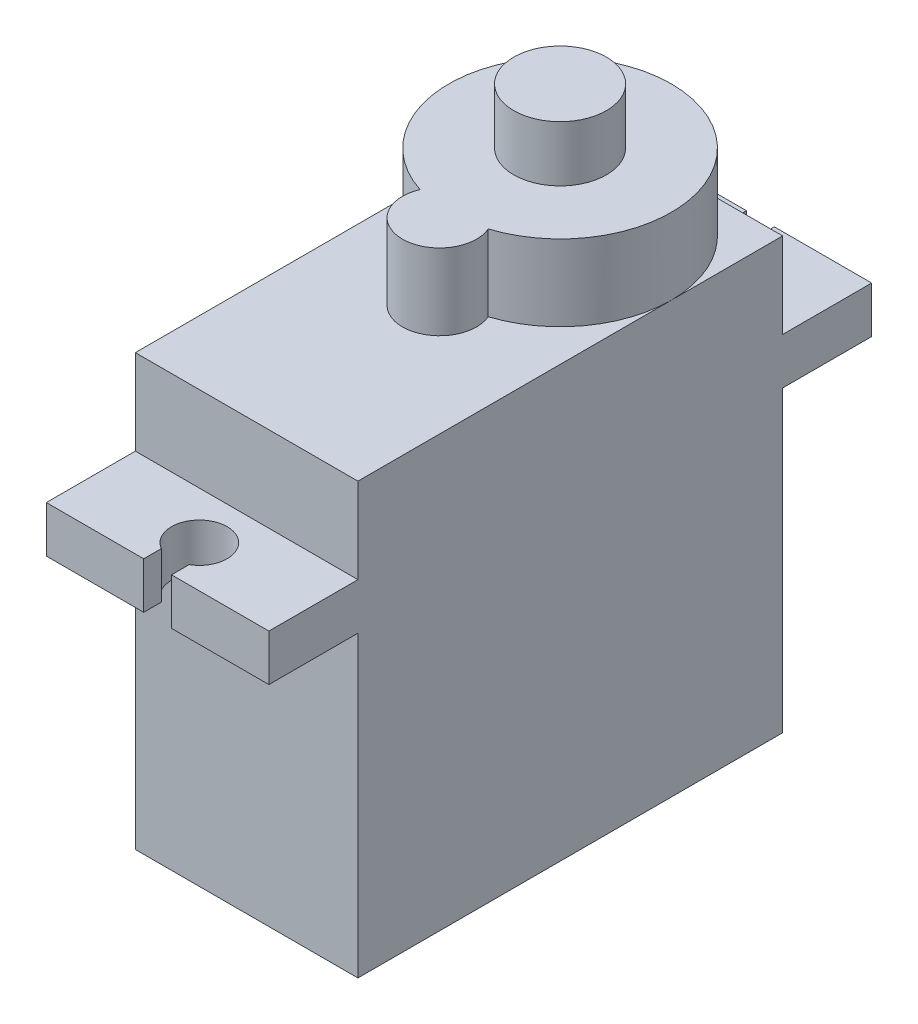
ISO-10303-21;
HEADER;
FILE_DESCRIPTION(('STEP AP214'),'2;1');
FILE_NAME('part.step','',(''),(''),'','','');
FILE_SCHEMA(('AUTOMOTIVE_DESIGN { 1 0 10303 214 1 1 1 1 }'));
ENDSEC;
DATA;
#1=APPLICATION_CONTEXT('core data for automotive mechanical design processes');
#2=APPLICATION_PROTOCOL_DEFINITION('international standard','automotive_design',2000,#1);
#3=PRODUCT_CONTEXT('',#1,'mechanical');
#4=PRODUCT('Part','Part','',(#3));
#5=PRODUCT_RELATED_PRODUCT_CATEGORY('part','',(#4));
#6=PRODUCT_DEFINITION_FORMATION('','',#4);
#7=PRODUCT_DEFINITION_CONTEXT('part definition',#1,'design');
#8=PRODUCT_DEFINITION('design','',#6,#7);
#9=PRODUCT_DEFINITION_SHAPE('','',#8);
#10=(LENGTH_UNIT() NAMED_UNIT(*) SI_UNIT(.MILLI.,.METRE.));
#11=(NAMED_UNIT(*) PLANE_ANGLE_UNIT() SI_UNIT($,.RADIAN.));
#12=(NAMED_UNIT(*) SI_UNIT($,.STERADIAN.) SOLID_ANGLE_UNIT());
#13=UNCERTAINTY_MEASURE_WITH_UNIT(LENGTH_MEASURE(1.E-05),#10,'distance_accuracy_value','');
#14=(GEOMETRIC_REPRESENTATION_CONTEXT(3) GLOBAL_UNCERTAINTY_ASSIGNED_CONTEXT((#13)) GLOBAL_UNIT_ASSIGNED_CONTEXT((#10,
#11,#12)) REPRESENTATION_CONTEXT('',''));
#15=CARTESIAN_POINT('',(0.,0.,0.));
#16=DIRECTION('',(0.,0.,1.));
#17=DIRECTION('',(1.,0.,0.));
#18=AXIS2_PLACEMENT_3D('',#15,#16,#17);
#19=CARTESIAN_POINT('',(0.,23.2,-22.9));
#20=DIRECTION('',(0.,0.,1.));
#21=DIRECTION('',(1.,0.,0.));
#22=AXIS2_PLACEMENT_3D('',#19,#20,#21);
#23=PLANE('',#22);
#24=DIRECTION('',(0.,-1.,0.));
#25=VECTOR('',#24,1.);
#26=CARTESIAN_POINT('',(8.,0.,-22.9));
#27=LINE('',#26,#25);
#28=CARTESIAN_POINT('',(8.,3.,-22.9));
#29=VERTEX_POINT('',#28);
#30=CARTESIAN_POINT('',(8.,0.,-22.9));
#31=VERTEX_POINT('',#30);
#32=EDGE_CURVE('E59',#29,#31,#27,.T.);
#33=ORIENTED_EDGE('',*,*,#32,.F.);
#34=DIRECTION('',(1.,0.,0.));
#35=VECTOR('',#34,1.);
#36=CARTESIAN_POINT('',(0.,3.,-22.9));
#37=LINE('',#36,#35);
#38=CARTESIAN_POINT('',(4.,3.,-22.9));
#39=VERTEX_POINT('',#38);
#40=EDGE_CURVE('E64',#39,#29,#37,.T.);
#41=ORIENTED_EDGE('',*,*,#40,.F.);
#42=DIRECTION('',(0.,-1.,0.));
#43=VECTOR('',#42,1.);
#44=CARTESIAN_POINT('',(4.,0.,-22.9));
#45=LINE('',#44,#43);
#46=CARTESIAN_POINT('',(4.,0.,-22.9));
#47=VERTEX_POINT('',#46);
#48=EDGE_CURVE('E245',#39,#47,#45,.T.);
#49=ORIENTED_EDGE('',*,*,#48,.T.);
#50=DIRECTION('',(-1.,0.,0.));
#51=VECTOR('',#50,1.);
#52=CARTESIAN_POINT('',(0.,0.,-22.9));
#53=LINE('',#52,#51);
#54=CARTESIAN_POINT('',(0.,0.,-22.9));
#55=VERTEX_POINT('',#54);
#56=EDGE_CURVE('E465',#47,#55,#53,.T.);
#57=ORIENTED_EDGE('',*,*,#56,.T.);
#58=DIRECTION('',(0.,-1.,0.));
#59=VECTOR('',#58,1.);
#60=CARTESIAN_POINT('',(0.,23.2,-22.9));
#61=LINE('',#60,#59);
#62=CARTESIAN_POINT('',(0.,16.1,-22.9));
#63=VERTEX_POINT('',#62);
#64=EDGE_CURVE('E453',#63,#55,#61,.T.);
#65=ORIENTED_EDGE('',*,*,#64,.F.);
#66=DIRECTION('',(1.,0.,0.));
#67=VECTOR('',#66,1.);
#68=CARTESIAN_POINT('',(0.,16.1,-22.9));
#69=LINE('',#68,#67);
#70=CARTESIAN_POINT('',(12.,16.1,-22.9));
#71=VERTEX_POINT('',#70);
#72=EDGE_CURVE('E312',#63,#71,#69,.T.);
#73=ORIENTED_EDGE('',*,*,#72,.T.);
#74=DIRECTION('',(0.,-1.,0.));
#75=VECTOR('',#74,1.);
#76=CARTESIAN_POINT('',(12.,23.2,-22.9));
#77=LINE('',#76,#75);
#78=CARTESIAN_POINT('',(12.,0.,-22.9));
#79=VERTEX_POINT('',#78);
#80=EDGE_CURVE('E473',#71,#79,#77,.T.);
#81=ORIENTED_EDGE('',*,*,#80,.T.);
#82=EDGE_CURVE('E466',#79,#31,#53,.T.);
#83=ORIENTED_EDGE('',*,*,#82,.T.);
#84=EDGE_LOOP('',(#33,#41,#49,#57,#65,#73,#81,#83));
#85=FACE_BOUND('',#84,.T.);
#86=ADVANCED_FACE('F40',(#85),#23,.F.);
#87=CARTESIAN_POINT('',(12.,18.6,-27.7));
#88=DIRECTION('',(0.,1.,0.));
#89=DIRECTION('',(0.,0.,1.));
#90=AXIS2_PLACEMENT_3D('',#87,#88,#89);
#91=PLANE('',#90);
#92=CARTESIAN_POINT('',(6.,18.6,-25.45));
#93=DIRECTION('',(0.,-1.,0.));
#94=DIRECTION('',(0.,0.,-1.));
#95=AXIS2_PLACEMENT_3D('',#92,#93,#94);
#96=CIRCLE('',#95,1.5);
#97=CARTESIAN_POINT('',(6.75,18.6,-26.7490381056767));
#98=VERTEX_POINT('',#97);
#99=CARTESIAN_POINT('',(5.25,18.6,-26.7490381056767));
#100=VERTEX_POINT('',#99);
#101=EDGE_CURVE('E261',#98,#100,#96,.T.);
#102=ORIENTED_EDGE('',*,*,#101,.T.);
#103=DIRECTION('',(0.,0.,-1.));
#104=VECTOR('',#103,1.);
#105=CARTESIAN_POINT('',(5.25,18.6,-22.9));
#106=LINE('',#105,#104);
#107=CARTESIAN_POINT('',(5.25,18.6,-27.7));
#108=VERTEX_POINT('',#107);
#109=EDGE_CURVE('E268',#100,#108,#106,.T.);
#110=ORIENTED_EDGE('',*,*,#109,.T.);
#111=DIRECTION('',(-1.,0.,0.));
#112=VECTOR('',#111,1.);
#113=CARTESIAN_POINT('',(12.,18.6,-27.7));
#114=LINE('',#113,#112);
#115=CARTESIAN_POINT('',(0.,18.6,-27.7));
#116=VERTEX_POINT('',#115);
#117=EDGE_CURVE('E295',#108,#116,#114,.T.);
#118=ORIENTED_EDGE('',*,*,#117,.T.);
#119=DIRECTION('',(0.,0.,1.));
#120=VECTOR('',#119,1.);
#121=CARTESIAN_POINT('',(0.,18.6,-27.7));
#122=LINE('',#121,#120);
#123=CARTESIAN_POINT('',(0.,18.6,-22.9));
#124=VERTEX_POINT('',#123);
#125=EDGE_CURVE('E308',#116,#124,#122,.T.);
#126=ORIENTED_EDGE('',*,*,#125,.T.);
#127=DIRECTION('',(-1.,0.,0.));
#128=VECTOR('',#127,1.);
#129=CARTESIAN_POINT('',(12.,18.6,-22.9));
#130=LINE('',#129,#128);
#131=CARTESIAN_POINT('',(12.,18.6,-22.9));
#132=VERTEX_POINT('',#131);
#133=EDGE_CURVE('E289',#132,#124,#130,.T.);
#134=ORIENTED_EDGE('',*,*,#133,.F.);
#135=DIRECTION('',(0.,0.,1.));
#136=VECTOR('',#135,1.);
#137=CARTESIAN_POINT('',(12.,18.6,-27.7));
#138=LINE('',#137,#136);
#139=CARTESIAN_POINT('',(12.,18.6,-27.7));
#140=VERTEX_POINT('',#139);
#141=EDGE_CURVE('E325',#140,#132,#138,.T.);
#142=ORIENTED_EDGE('',*,*,#141,.F.);
#143=CARTESIAN_POINT('',(6.75,18.6,-27.7));
#144=VERTEX_POINT('',#143);
#145=EDGE_CURVE('E290',#140,#144,#114,.T.);
#146=ORIENTED_EDGE('',*,*,#145,.T.);
#147=DIRECTION('',(0.,0.,-1.));
#148=VECTOR('',#147,1.);
#149=CARTESIAN_POINT('',(6.75,18.6,-22.9));
#150=LINE('',#149,#148);
#151=EDGE_CURVE('E265',#98,#144,#150,.T.);
#152=ORIENTED_EDGE('',*,*,#151,.F.);
#153=EDGE_LOOP('',(#102,#110,#118,#126,#134,#142,#146,#152));
#154=FACE_BOUND('',#153,.T.);
#155=ADVANCED_FACE('F528',(#154),#91,.T.);
#156=CARTESIAN_POINT('',(0.,16.1,-27.7));
#157=DIRECTION('',(0.,-1.,0.));
#158=DIRECTION('',(0.,0.,-1.));
#159=AXIS2_PLACEMENT_3D('',#156,#157,#158);
#160=PLANE('',#159);
#161=DIRECTION('',(1.,0.,0.));
#162=VECTOR('',#161,1.);
#163=CARTESIAN_POINT('',(0.,16.1,-27.7));
#164=LINE('',#163,#162);
#165=CARTESIAN_POINT('',(0.,16.1,-27.7));
#166=VERTEX_POINT('',#165);
#167=CARTESIAN_POINT('',(5.25,16.1,-27.7));
#168=VERTEX_POINT('',#167);
#169=EDGE_CURVE('E300',#166,#168,#164,.T.);
#170=ORIENTED_EDGE('',*,*,#169,.T.);
#171=DIRECTION('',(0.,0.,-1.));
#172=VECTOR('',#171,1.);
#173=CARTESIAN_POINT('',(5.25,16.1,-22.9));
#174=LINE('',#173,#172);
#175=CARTESIAN_POINT('',(5.25,16.1,-26.7490381056767));
#176=VERTEX_POINT('',#175);
#177=EDGE_CURVE('E253',#176,#168,#174,.T.);
#178=ORIENTED_EDGE('',*,*,#177,.F.);
#179=CARTESIAN_POINT('',(6.,16.1,-25.45));
#180=DIRECTION('',(0.,-1.,0.));
#181=DIRECTION('',(0.,0.,-1.));
#182=AXIS2_PLACEMENT_3D('',#179,#180,#181);
#183=CIRCLE('',#182,1.5);
#184=CARTESIAN_POINT('',(6.75,16.1,-26.7490381056767));
#185=VERTEX_POINT('',#184);
#186=EDGE_CURVE('E249',#185,#176,#183,.T.);
#187=ORIENTED_EDGE('',*,*,#186,.F.);
#188=DIRECTION('',(0.,0.,-1.));
#189=VECTOR('',#188,1.);
#190=CARTESIAN_POINT('',(6.75,16.1,-22.9));
#191=LINE('',#190,#189);
#192=CARTESIAN_POINT('',(6.75,16.1,-27.7));
#193=VERTEX_POINT('',#192);
#194=EDGE_CURVE('E276',#185,#193,#191,.T.);
#195=ORIENTED_EDGE('',*,*,#194,.T.);
#196=CARTESIAN_POINT('',(12.,16.1,-27.7));
#197=VERTEX_POINT('',#196);
#198=EDGE_CURVE('E299',#193,#197,#164,.T.);
#199=ORIENTED_EDGE('',*,*,#198,.T.);
#200=DIRECTION('',(0.,0.,1.));
#201=VECTOR('',#200,1.);
#202=CARTESIAN_POINT('',(12.,16.1,-27.7));
#203=LINE('',#202,#201);
#204=EDGE_CURVE('E322',#197,#71,#203,.T.);
#205=ORIENTED_EDGE('',*,*,#204,.T.);
#206=ORIENTED_EDGE('',*,*,#72,.F.);
#207=DIRECTION('',(0.,0.,1.));
#208=VECTOR('',#207,1.);
#209=CARTESIAN_POINT('',(0.,16.1,-27.7));
#210=LINE('',#209,#208);
#211=EDGE_CURVE('E318',#166,#63,#210,.T.);
#212=ORIENTED_EDGE('',*,*,#211,.F.);
#213=EDGE_LOOP('',(#170,#178,#187,#195,#199,#205,#206,#212));
#214=FACE_BOUND('',#213,.T.);
#215=ADVANCED_FACE('F541',(#214),#160,.T.);
#216=CARTESIAN_POINT('',(0.,0.,-27.7));
#217=DIRECTION('',(0.,0.,-1.));
#218=DIRECTION('',(1.,0.,0.));
#219=AXIS2_PLACEMENT_3D('',#216,#217,#218);
#220=PLANE('',#219);
#221=ORIENTED_EDGE('',*,*,#117,.F.);
#222=DIRECTION('',(0.,1.,0.));
#223=VECTOR('',#222,1.);
#224=CARTESIAN_POINT('',(5.25,-0.001000000000001,-27.7));
#225=LINE('',#224,#223);
#226=EDGE_CURVE('E277',#168,#108,#225,.T.);
#227=ORIENTED_EDGE('',*,*,#226,.F.);
#228=ORIENTED_EDGE('',*,*,#169,.F.);
#229=DIRECTION('',(0.,-1.,0.));
#230=VECTOR('',#229,1.);
#231=CARTESIAN_POINT('',(0.,18.6,-27.7));
#232=LINE('',#231,#230);
#233=EDGE_CURVE('E304',#116,#166,#232,.T.);
#234=ORIENTED_EDGE('',*,*,#233,.F.);
#235=EDGE_LOOP('',(#221,#227,#228,#234));
#236=FACE_BOUND('',#235,.T.);
#237=ADVANCED_FACE('F538',(#236),#220,.T.);
#238=CARTESIAN_POINT('',(12.,23.2,-22.9));
#239=VERTEX_POINT('',#238);
#240=EDGE_CURVE('E474',#239,#132,#77,.T.);
#241=ORIENTED_EDGE('',*,*,#240,.T.);
#242=ORIENTED_EDGE('',*,*,#133,.T.);
#243=CARTESIAN_POINT('',(0.,23.2,-22.9));
#244=VERTEX_POINT('',#243);
#245=EDGE_CURVE('E469',#244,#124,#61,.T.);
#246=ORIENTED_EDGE('',*,*,#245,.F.);
#247=DIRECTION('',(-1.,0.,0.));
#248=VECTOR('',#247,1.);
#249=CARTESIAN_POINT('',(0.,23.2,-22.9));
#250=LINE('',#249,#248);
#251=CARTESIAN_POINT('',(6.,23.2,-22.9));
#252=VERTEX_POINT('',#251);
#253=EDGE_CURVE('E448',#252,#244,#250,.T.);
#254=ORIENTED_EDGE('',*,*,#253,.F.);
#255=EDGE_CURVE('E449',#239,#252,#250,.T.);
#256=ORIENTED_EDGE('',*,*,#255,.F.);
#257=EDGE_LOOP('',(#241,#242,#246,#254,#256));
#258=FACE_BOUND('',#257,.T.);
#259=ADVANCED_FACE('F569',(#258),#23,.F.);
#260=CARTESIAN_POINT('',(12.,18.6,4.8));
#261=DIRECTION('',(0.,-1.,0.));
#262=DIRECTION('',(0.,0.,-1.));
#263=AXIS2_PLACEMENT_3D('',#260,#261,#262);
#264=PLANE('',#263);
#265=DIRECTION('',(0.,0.,1.));
#266=VECTOR('',#265,1.);
#267=CARTESIAN_POINT('',(6.75,18.6,0.));
#268=LINE('',#267,#266);
#269=CARTESIAN_POINT('',(6.75,18.6,3.84903810567666));
#270=VERTEX_POINT('',#269);
#271=CARTESIAN_POINT('',(6.75,18.6,4.8));
#272=VERTEX_POINT('',#271);
#273=EDGE_CURVE('E343',#270,#272,#268,.T.);
#274=ORIENTED_EDGE('',*,*,#273,.T.);
#275=DIRECTION('',(-1.,0.,0.));
#276=VECTOR('',#275,1.);
#277=CARTESIAN_POINT('',(12.,18.6,4.8));
#278=LINE('',#277,#276);
#279=CARTESIAN_POINT('',(12.,18.6,4.8));
#280=VERTEX_POINT('',#279);
#281=EDGE_CURVE('E365',#280,#272,#278,.T.);
#282=ORIENTED_EDGE('',*,*,#281,.F.);
#283=DIRECTION('',(0.,0.,-1.));
#284=VECTOR('',#283,1.);
#285=CARTESIAN_POINT('',(12.,18.6,4.8));
#286=LINE('',#285,#284);
#287=CARTESIAN_POINT('',(12.,18.6,0.));
#288=VERTEX_POINT('',#287);
#289=EDGE_CURVE('E381',#280,#288,#286,.T.);
#290=ORIENTED_EDGE('',*,*,#289,.T.);
#291=DIRECTION('',(-1.,0.,0.));
#292=VECTOR('',#291,1.);
#293=CARTESIAN_POINT('',(12.,18.6,0.));
#294=LINE('',#293,#292);
#295=CARTESIAN_POINT('',(0.,18.6,0.));
#296=VERTEX_POINT('',#295);
#297=EDGE_CURVE('E364',#288,#296,#294,.T.);
#298=ORIENTED_EDGE('',*,*,#297,.T.);
#299=DIRECTION('',(0.,0.,-1.));
#300=VECTOR('',#299,1.);
#301=CARTESIAN_POINT('',(0.,18.6,4.8));
#302=LINE('',#301,#300);
#303=CARTESIAN_POINT('',(0.,18.6,4.8));
#304=VERTEX_POINT('',#303);
#305=EDGE_CURVE('E400',#304,#296,#302,.T.);
#306=ORIENTED_EDGE('',*,*,#305,.F.);
#307=CARTESIAN_POINT('',(5.25,18.6,4.8));
#308=VERTEX_POINT('',#307);
#309=EDGE_CURVE('E370',#308,#304,#278,.T.);
#310=ORIENTED_EDGE('',*,*,#309,.F.);
#311=DIRECTION('',(0.,0.,1.));
#312=VECTOR('',#311,1.);
#313=CARTESIAN_POINT('',(5.25,18.6,0.));
#314=LINE('',#313,#312);
#315=CARTESIAN_POINT('',(5.25,18.6,3.84903810567666));
#316=VERTEX_POINT('',#315);
#317=EDGE_CURVE('E340',#316,#308,#314,.T.);
#318=ORIENTED_EDGE('',*,*,#317,.F.);
#319=CARTESIAN_POINT('',(6.,18.6,2.55));
#320=DIRECTION('',(0.,1.,0.));
#321=DIRECTION('',(0.,0.,1.));
#322=AXIS2_PLACEMENT_3D('',#319,#320,#321);
#323=CIRCLE('',#322,1.5);
#324=EDGE_CURVE('E336',#270,#316,#323,.T.);
#325=ORIENTED_EDGE('',*,*,#324,.F.);
#326=EDGE_LOOP('',(#274,#282,#290,#298,#306,#310,#318,#325));
#327=FACE_BOUND('',#326,.T.);
#328=ADVANCED_FACE('F608',(#327),#264,.F.);
#329=CARTESIAN_POINT('',(0.,16.1,4.8));
#330=DIRECTION('',(0.,1.,0.));
#331=DIRECTION('',(0.,0.,1.));
#332=AXIS2_PLACEMENT_3D('',#329,#330,#331);
#333=PLANE('',#332);
#334=DIRECTION('',(0.,0.,-1.));
#335=VECTOR('',#334,1.);
#336=CARTESIAN_POINT('',(6.75,16.1,0.));
#337=LINE('',#336,#335);
#338=CARTESIAN_POINT('',(6.75,16.1,4.8));
#339=VERTEX_POINT('',#338);
#340=CARTESIAN_POINT('',(6.75,16.1,3.84903810567666));
#341=VERTEX_POINT('',#340);
#342=EDGE_CURVE('E332',#339,#341,#337,.T.);
#343=ORIENTED_EDGE('',*,*,#342,.T.);
#344=CARTESIAN_POINT('',(6.,16.1,2.55));
#345=DIRECTION('',(0.,1.,0.));
#346=DIRECTION('',(0.,0.,1.));
#347=AXIS2_PLACEMENT_3D('',#344,#345,#346);
#348=CIRCLE('',#347,1.5);
#349=CARTESIAN_POINT('',(5.25,16.1,3.84903810567666));
#350=VERTEX_POINT('',#349);
#351=EDGE_CURVE('E328',#350,#341,#348,.F.);
#352=ORIENTED_EDGE('',*,*,#351,.F.);
#353=DIRECTION('',(0.,0.,-1.));
#354=VECTOR('',#353,1.);
#355=CARTESIAN_POINT('',(5.25,16.1,0.));
#356=LINE('',#355,#354);
#357=CARTESIAN_POINT('',(5.25,16.1,4.8));
#358=VERTEX_POINT('',#357);
#359=EDGE_CURVE('E351',#358,#350,#356,.T.);
#360=ORIENTED_EDGE('',*,*,#359,.F.);
#361=DIRECTION('',(1.,0.,0.));
#362=VECTOR('',#361,1.);
#363=CARTESIAN_POINT('',(0.,16.1,4.8));
#364=LINE('',#363,#362);
#365=CARTESIAN_POINT('',(0.,16.1,4.8));
#366=VERTEX_POINT('',#365);
#367=EDGE_CURVE('E374',#366,#358,#364,.T.);
#368=ORIENTED_EDGE('',*,*,#367,.F.);
#369=DIRECTION('',(0.,0.,-1.));
#370=VECTOR('',#369,1.);
#371=CARTESIAN_POINT('',(0.,16.1,4.8));
#372=LINE('',#371,#370);
#373=CARTESIAN_POINT('',(0.,16.1,0.));
#374=VERTEX_POINT('',#373);
#375=EDGE_CURVE('E396',#366,#374,#372,.T.);
#376=ORIENTED_EDGE('',*,*,#375,.T.);
#377=DIRECTION('',(1.,0.,0.));
#378=VECTOR('',#377,1.);
#379=CARTESIAN_POINT('',(0.,16.1,0.));
#380=LINE('',#379,#378);
#381=CARTESIAN_POINT('',(12.,16.1,0.));
#382=VERTEX_POINT('',#381);
#383=EDGE_CURVE('E385',#374,#382,#380,.T.);
#384=ORIENTED_EDGE('',*,*,#383,.T.);
#385=DIRECTION('',(0.,0.,-1.));
#386=VECTOR('',#385,1.);
#387=CARTESIAN_POINT('',(12.,16.1,4.8));
#388=LINE('',#387,#386);
#389=CARTESIAN_POINT('',(12.,16.1,4.8));
#390=VERTEX_POINT('',#389);
#391=EDGE_CURVE('E392',#390,#382,#388,.T.);
#392=ORIENTED_EDGE('',*,*,#391,.F.);
#393=EDGE_CURVE('E373',#339,#390,#364,.T.);
#394=ORIENTED_EDGE('',*,*,#393,.F.);
#395=EDGE_LOOP('',(#343,#352,#360,#368,#376,#384,#392,#394));
#396=FACE_BOUND('',#395,.T.);
#397=ADVANCED_FACE('F613',(#396),#333,.F.);
#398=CARTESIAN_POINT('',(0.,0.,4.8));
#399=DIRECTION('',(0.,0.,1.));
#400=DIRECTION('',(1.,0.,0.));
#401=AXIS2_PLACEMENT_3D('',#398,#399,#400);
#402=PLANE('',#401);
#403=ORIENTED_EDGE('',*,*,#281,.T.);
#404=DIRECTION('',(0.,1.,0.));
#405=VECTOR('',#404,1.);
#406=CARTESIAN_POINT('',(6.75,-0.001000000000001,4.8));
#407=LINE('',#406,#405);
#408=EDGE_CURVE('E352',#339,#272,#407,.T.);
#409=ORIENTED_EDGE('',*,*,#408,.F.);
#410=ORIENTED_EDGE('',*,*,#393,.T.);
#411=DIRECTION('',(0.,1.,0.));
#412=VECTOR('',#411,1.);
#413=CARTESIAN_POINT('',(12.,16.1,4.8));
#414=LINE('',#413,#412);
#415=EDGE_CURVE('E378',#390,#280,#414,.T.);
#416=ORIENTED_EDGE('',*,*,#415,.T.);
#417=EDGE_LOOP('',(#403,#409,#410,#416));
#418=FACE_BOUND('',#417,.T.);
#419=ADVANCED_FACE('F644',(#418),#402,.T.);
#420=CARTESIAN_POINT('',(0.,23.2,0.));
#421=DIRECTION('',(0.,0.,-1.));
#422=DIRECTION('',(-1.,0.,0.));
#423=AXIS2_PLACEMENT_3D('',#420,#421,#422);
#424=PLANE('',#423);
#425=ORIENTED_EDGE('',*,*,#297,.F.);
#426=DIRECTION('',(0.,-1.,0.));
#427=VECTOR('',#426,1.);
#428=CARTESIAN_POINT('',(12.,23.2,0.));
#429=LINE('',#428,#427);
#430=CARTESIAN_POINT('',(12.,23.2,0.));
#431=VERTEX_POINT('',#430);
#432=EDGE_CURVE('E478',#431,#288,#429,.T.);
#433=ORIENTED_EDGE('',*,*,#432,.F.);
#434=DIRECTION('',(1.,0.,0.));
#435=VECTOR('',#434,1.);
#436=CARTESIAN_POINT('',(0.,23.2,0.));
#437=LINE('',#436,#435);
#438=CARTESIAN_POINT('',(0.,23.2,0.));
#439=VERTEX_POINT('',#438);
#440=EDGE_CURVE('E439',#439,#431,#437,.T.);
#441=ORIENTED_EDGE('',*,*,#440,.F.);
#442=DIRECTION('',(0.,-1.,0.));
#443=VECTOR('',#442,1.);
#444=CARTESIAN_POINT('',(0.,23.2,0.));
#445=LINE('',#444,#443);
#446=EDGE_CURVE('E44',#439,#296,#445,.T.);
#447=ORIENTED_EDGE('',*,*,#446,.T.);
#448=EDGE_LOOP('',(#425,#433,#441,#447));
#449=FACE_BOUND('',#448,.T.);
#450=ADVANCED_FACE('F554',(#449),#424,.F.);
#451=ORIENTED_EDGE('',*,*,#383,.F.);
#452=CARTESIAN_POINT('',(0.,0.,0.));
#453=VERTEX_POINT('',#452);
#454=EDGE_CURVE('E481',#374,#453,#445,.T.);
#455=ORIENTED_EDGE('',*,*,#454,.T.);
#456=DIRECTION('',(1.,0.,0.));
#457=VECTOR('',#456,1.);
#458=CARTESIAN_POINT('',(0.,0.,0.));
#459=LINE('',#458,#457);
#460=CARTESIAN_POINT('',(12.,0.,0.));
#461=VERTEX_POINT('',#460);
#462=EDGE_CURVE('E457',#453,#461,#459,.T.);
#463=ORIENTED_EDGE('',*,*,#462,.T.);
#464=EDGE_CURVE('E477',#382,#461,#429,.T.);
#465=ORIENTED_EDGE('',*,*,#464,.F.);
#466=EDGE_LOOP('',(#451,#455,#463,#465));
#467=FACE_BOUND('',#466,.T.);
#468=ADVANCED_FACE('F496',(#467),#424,.F.);
#469=CARTESIAN_POINT('',(0.,23.2,0.));
#470=DIRECTION('',(0.,-1.,0.));
#471=DIRECTION('',(0.,0.,-1.));
#472=AXIS2_PLACEMENT_3D('',#469,#470,#471);
#473=PLANE('',#472);
#474=CARTESIAN_POINT('',(6.,23.2,-10.4));
#475=DIRECTION('',(0.,1.,0.));
#476=DIRECTION('',(0.,0.,1.));
#477=AXIS2_PLACEMENT_3D('',#474,#475,#476);
#478=CIRCLE('',#477,2.);
#479=CARTESIAN_POINT('',(4.16197703976069,23.2,-11.1884615384615));
#480=VERTEX_POINT('',#479);
#481=CARTESIAN_POINT('',(7.83802296023931,23.2,-11.1884615384615));
#482=VERTEX_POINT('',#481);
#483=EDGE_CURVE('E409',#480,#482,#478,.T.);
#484=ORIENTED_EDGE('',*,*,#483,.F.);
#485=CARTESIAN_POINT('',(6.,23.2,-16.9));
#486=DIRECTION('',(0.,1.,0.));
#487=DIRECTION('',(0.,0.,1.));
#488=AXIS2_PLACEMENT_3D('',#485,#486,#487);
#489=CIRCLE('',#488,6.);
#490=CARTESIAN_POINT('',(0.,23.2,-16.9));
#491=VERTEX_POINT('',#490);
#492=EDGE_CURVE('E426',#491,#480,#489,.T.);
#493=ORIENTED_EDGE('',*,*,#492,.F.);
#494=DIRECTION('',(0.,0.,1.));
#495=VECTOR('',#494,1.);
#496=CARTESIAN_POINT('',(0.,23.2,0.));
#497=LINE('',#496,#495);
#498=EDGE_CURVE('E440',#491,#439,#497,.T.);
#499=ORIENTED_EDGE('',*,*,#498,.T.);
#500=ORIENTED_EDGE('',*,*,#440,.T.);
#501=DIRECTION('',(0.,0.,-1.));
#502=VECTOR('',#501,1.);
#503=CARTESIAN_POINT('',(12.,23.2,0.));
#504=LINE('',#503,#502);
#505=CARTESIAN_POINT('',(12.,23.2,-16.9));
#506=VERTEX_POINT('',#505);
#507=EDGE_CURVE('E444',#431,#506,#504,.T.);
#508=ORIENTED_EDGE('',*,*,#507,.T.);
#509=EDGE_CURVE('E52',#482,#506,#489,.T.);
#510=ORIENTED_EDGE('',*,*,#509,.F.);
#511=EDGE_LOOP('',(#484,#493,#499,#500,#508,#510));
#512=FACE_BOUND('',#511,.T.);
#513=ADVANCED_FACE('F550',(#512),#473,.F.);
#514=EDGE_CURVE('E11',#506,#252,#489,.T.);
#515=ORIENTED_EDGE('',*,*,#514,.F.);
#516=EDGE_CURVE('E443',#506,#239,#504,.T.);
#517=ORIENTED_EDGE('',*,*,#516,.T.);
#518=ORIENTED_EDGE('',*,*,#255,.T.);
#519=EDGE_LOOP('',(#515,#517,#518));
#520=FACE_BOUND('',#519,.T.);
#521=ADVANCED_FACE('F571',(#520),#473,.F.);
#522=CARTESIAN_POINT('',(0.,23.2,0.));
#523=DIRECTION('',(1.,0.,0.));
#524=DIRECTION('',(0.,0.,-1.));
#525=AXIS2_PLACEMENT_3D('',#522,#523,#524);
#526=PLANE('',#525);
#527=DIRECTION('',(0.,0.,1.));
#528=VECTOR('',#527,1.);
#529=CARTESIAN_POINT('',(0.,0.,0.));
#530=LINE('',#529,#528);
#531=EDGE_CURVE('E434',#55,#453,#530,.T.);
#532=ORIENTED_EDGE('',*,*,#531,.T.);
#533=ORIENTED_EDGE('',*,*,#454,.F.);
#534=ORIENTED_EDGE('',*,*,#375,.F.);
#535=DIRECTION('',(0.,-1.,0.));
#536=VECTOR('',#535,1.);
#537=CARTESIAN_POINT('',(0.,18.6,4.8));
#538=LINE('',#537,#536);
#539=EDGE_CURVE('E369',#304,#366,#538,.T.);
#540=ORIENTED_EDGE('',*,*,#539,.F.);
#541=ORIENTED_EDGE('',*,*,#305,.T.);
#542=ORIENTED_EDGE('',*,*,#446,.F.);
#543=ORIENTED_EDGE('',*,*,#498,.F.);
#544=EDGE_CURVE('E435',#244,#491,#497,.T.);
#545=ORIENTED_EDGE('',*,*,#544,.F.);
#546=ORIENTED_EDGE('',*,*,#245,.T.);
#547=ORIENTED_EDGE('',*,*,#125,.F.);
#548=ORIENTED_EDGE('',*,*,#233,.T.);
#549=ORIENTED_EDGE('',*,*,#211,.T.);
#550=ORIENTED_EDGE('',*,*,#64,.T.);
#551=EDGE_LOOP('',(#532,#533,#534,#540,#541,#542,#543,#545,#546,#547,#548,#549,#550));
#552=FACE_BOUND('',#551,.T.);
#553=ADVANCED_FACE('F42',(#552),#526,.F.);
#554=CARTESIAN_POINT('',(12.,23.2,0.));
#555=DIRECTION('',(-1.,0.,0.));
#556=DIRECTION('',(0.,0.,1.));
#557=AXIS2_PLACEMENT_3D('',#554,#555,#556);
#558=PLANE('',#557);
#559=DIRECTION('',(0.,0.,-1.));
#560=VECTOR('',#559,1.);
#561=CARTESIAN_POINT('',(12.,0.,0.));
#562=LINE('',#561,#560);
#563=EDGE_CURVE('E461',#461,#79,#562,.T.);
#564=ORIENTED_EDGE('',*,*,#563,.T.);
#565=ORIENTED_EDGE('',*,*,#80,.F.);
#566=ORIENTED_EDGE('',*,*,#204,.F.);
#567=DIRECTION('',(0.,1.,0.));
#568=VECTOR('',#567,1.);
#569=CARTESIAN_POINT('',(12.,16.1,-27.7));
#570=LINE('',#569,#568);
#571=EDGE_CURVE('E294',#197,#140,#570,.T.);
#572=ORIENTED_EDGE('',*,*,#571,.T.);
#573=ORIENTED_EDGE('',*,*,#141,.T.);
#574=ORIENTED_EDGE('',*,*,#240,.F.);
#575=ORIENTED_EDGE('',*,*,#516,.F.);
#576=ORIENTED_EDGE('',*,*,#507,.F.);
#577=ORIENTED_EDGE('',*,*,#432,.T.);
#578=ORIENTED_EDGE('',*,*,#289,.F.);
#579=ORIENTED_EDGE('',*,*,#415,.F.);
#580=ORIENTED_EDGE('',*,*,#391,.T.);
#581=ORIENTED_EDGE('',*,*,#464,.T.);
#582=EDGE_LOOP('',(#564,#565,#566,#572,#573,#574,#575,#576,#577,#578,#579,#580,#581));
#583=FACE_BOUND('',#582,.T.);
#584=ADVANCED_FACE('F488',(#583),#558,.F.);
#585=EDGE_CURVE('E50',#252,#491,#489,.T.);
#586=ORIENTED_EDGE('',*,*,#585,.F.);
#587=ORIENTED_EDGE('',*,*,#253,.T.);
#588=ORIENTED_EDGE('',*,*,#544,.T.);
#589=EDGE_LOOP('',(#586,#587,#588));
#590=FACE_BOUND('',#589,.T.);
#591=ADVANCED_FACE('F566',(#590),#473,.F.);
#592=CARTESIAN_POINT('',(0.,0.,0.));
#593=DIRECTION('',(0.,-1.,0.));
#594=DIRECTION('',(0.,0.,-1.));
#595=AXIS2_PLACEMENT_3D('',#592,#593,#594);
#596=PLANE('',#595);
#597=ORIENTED_EDGE('',*,*,#531,.F.);
#598=ORIENTED_EDGE('',*,*,#56,.F.);
#599=DIRECTION('',(0.,0.,1.));
#600=VECTOR('',#599,1.);
#601=CARTESIAN_POINT('',(4.,0.,-25.9));
#602=LINE('',#601,#600);
#603=CARTESIAN_POINT('',(4.,0.,-25.9));
#604=VERTEX_POINT('',#603);
#605=EDGE_CURVE('E255',#604,#47,#602,.T.);
#606=ORIENTED_EDGE('',*,*,#605,.F.);
#607=DIRECTION('',(-1.,0.,0.));
#608=VECTOR('',#607,1.);
#609=CARTESIAN_POINT('',(0.,0.,-25.9));
#610=LINE('',#609,#608);
#611=CARTESIAN_POINT('',(8.,0.,-25.9));
#612=VERTEX_POINT('',#611);
#613=EDGE_CURVE('E235',#612,#604,#610,.T.);
#614=ORIENTED_EDGE('',*,*,#613,.F.);
#615=DIRECTION('',(0.,0.,1.));
#616=VECTOR('',#615,1.);
#617=CARTESIAN_POINT('',(8.,0.,-25.9));
#618=LINE('',#617,#616);
#619=EDGE_CURVE('E231',#612,#31,#618,.T.);
#620=ORIENTED_EDGE('',*,*,#619,.T.);
#621=ORIENTED_EDGE('',*,*,#82,.F.);
#622=ORIENTED_EDGE('',*,*,#563,.F.);
#623=ORIENTED_EDGE('',*,*,#462,.F.);
#624=EDGE_LOOP('',(#597,#598,#606,#614,#620,#621,#622,#623));
#625=FACE_BOUND('',#624,.T.);
#626=ADVANCED_FACE('F500',(#625),#596,.T.);
#627=CARTESIAN_POINT('',(6.,27.3,-10.4));
#628=DIRECTION('',(0.,-1.,0.));
#629=DIRECTION('',(0.,0.,-1.));
#630=AXIS2_PLACEMENT_3D('',#627,#628,#629);
#631=CYLINDRICAL_SURFACE('',#630,2.);
#632=ORIENTED_EDGE('',*,*,#483,.T.);
#633=DIRECTION('',(0.,-1.,0.));
#634=VECTOR('',#633,1.);
#635=CARTESIAN_POINT('',(7.83802296023931,27.3,-11.1884615384615));
#636=LINE('',#635,#634);
#637=CARTESIAN_POINT('',(7.83802296023931,27.3,-11.1884615384615));
#638=VERTEX_POINT('',#637);
#639=EDGE_CURVE('E430',#638,#482,#636,.T.);
#640=ORIENTED_EDGE('',*,*,#639,.F.);
#641=CARTESIAN_POINT('',(6.,27.3,-10.4));
#642=DIRECTION('',(0.,1.,0.));
#643=DIRECTION('',(0.,0.,1.));
#644=AXIS2_PLACEMENT_3D('',#641,#642,#643);
#645=CIRCLE('',#644,2.);
#646=CARTESIAN_POINT('',(4.16197703976069,27.3,-11.1884615384615));
#647=VERTEX_POINT('',#646);
#648=EDGE_CURVE('E413',#647,#638,#645,.T.);
#649=ORIENTED_EDGE('',*,*,#648,.F.);
#650=DIRECTION('',(0.,-1.,0.));
#651=VECTOR('',#650,1.);
#652=CARTESIAN_POINT('',(4.16197703976069,27.3,-11.1884615384615));
#653=LINE('',#652,#651);
#654=EDGE_CURVE('E420',#647,#480,#653,.T.);
#655=ORIENTED_EDGE('',*,*,#654,.T.);
#656=EDGE_LOOP('',(#632,#640,#649,#655));
#657=FACE_BOUND('',#656,.T.);
#658=ADVANCED_FACE('F661',(#657),#631,.T.);
#659=CARTESIAN_POINT('',(6.,27.3,-16.9));
#660=DIRECTION('',(0.,-1.,0.));
#661=DIRECTION('',(0.,0.,-1.));
#662=AXIS2_PLACEMENT_3D('',#659,#660,#661);
#663=CYLINDRICAL_SURFACE('',#662,6.);
#664=ORIENTED_EDGE('',*,*,#509,.T.);
#665=ORIENTED_EDGE('',*,*,#514,.T.);
#666=ORIENTED_EDGE('',*,*,#585,.T.);
#667=ORIENTED_EDGE('',*,*,#492,.T.);
#668=ORIENTED_EDGE('',*,*,#654,.F.);
#669=CARTESIAN_POINT('',(6.,27.3,-16.9));
#670=DIRECTION('',(0.,1.,0.));
#671=DIRECTION('',(0.,0.,1.));
#672=AXIS2_PLACEMENT_3D('',#669,#670,#671);
#673=CIRCLE('',#672,6.);
#674=EDGE_CURVE('E417',#638,#647,#673,.T.);
#675=ORIENTED_EDGE('',*,*,#674,.F.);
#676=ORIENTED_EDGE('',*,*,#639,.T.);
#677=EDGE_LOOP('',(#664,#665,#666,#667,#668,#675,#676));
#678=FACE_BOUND('',#677,.T.);
#679=ADVANCED_FACE('F563',(#678),#663,.T.);
#680=CARTESIAN_POINT('',(0.,27.3,0.));
#681=DIRECTION('',(0.,1.,0.));
#682=DIRECTION('',(0.,0.,1.));
#683=AXIS2_PLACEMENT_3D('',#680,#681,#682);
#684=PLANE('',#683);
#685=CARTESIAN_POINT('',(6.,27.3,-16.9));
#686=DIRECTION('',(0.,1.,0.));
#687=DIRECTION('',(0.,0.,1.));
#688=AXIS2_PLACEMENT_3D('',#685,#686,#687);
#689=CIRCLE('',#688,2.5);
#690=CARTESIAN_POINT('',(6.,27.3,-14.4));
#691=VERTEX_POINT('',#690);
#692=EDGE_CURVE('E404',#691,#691,#689,.T.);
#693=ORIENTED_EDGE('',*,*,#692,.F.);
#694=EDGE_LOOP('',(#693));
#695=FACE_BOUND('',#694,.T.);
#696=ORIENTED_EDGE('',*,*,#648,.T.);
#697=ORIENTED_EDGE('',*,*,#674,.T.);
#698=EDGE_LOOP('',(#696,#697));
#699=FACE_BOUND('',#698,.T.);
#700=ADVANCED_FACE('F654',(#695,#699),#684,.T.);
#701=CARTESIAN_POINT('',(6.,30.3,-16.9));
#702=DIRECTION('',(0.,-1.,0.));
#703=DIRECTION('',(0.,0.,-1.));
#704=AXIS2_PLACEMENT_3D('',#701,#702,#703);
#705=CYLINDRICAL_SURFACE('',#704,2.5);
#706=CARTESIAN_POINT('',(6.,30.3,-16.9));
#707=DIRECTION('',(0.,1.,0.));
#708=DIRECTION('',(0.,0.,1.));
#709=AXIS2_PLACEMENT_3D('',#706,#707,#708);
#710=CIRCLE('',#709,2.5);
#711=CARTESIAN_POINT('',(6.,30.3,-14.4));
#712=VERTEX_POINT('',#711);
#713=EDGE_CURVE('E405',#712,#712,#710,.T.);
#714=ORIENTED_EDGE('',*,*,#713,.F.);
#715=EDGE_LOOP('',(#714));
#716=FACE_BOUND('',#715,.T.);
#717=ORIENTED_EDGE('',*,*,#692,.T.);
#718=EDGE_LOOP('',(#717));
#719=FACE_BOUND('',#718,.T.);
#720=ADVANCED_FACE('F650',(#716,#719),#705,.T.);
#721=CARTESIAN_POINT('',(0.,30.3,0.));
#722=DIRECTION('',(0.,1.,0.));
#723=DIRECTION('',(0.,0.,1.));
#724=AXIS2_PLACEMENT_3D('',#721,#722,#723);
#725=PLANE('',#724);
#726=ORIENTED_EDGE('',*,*,#713,.T.);
#727=EDGE_LOOP('',(#726));
#728=FACE_BOUND('',#727,.T.);
#729=ADVANCED_FACE('F642',(#728),#725,.T.);
#730=DIRECTION('',(0.,1.,0.));
#731=VECTOR('',#730,1.);
#732=CARTESIAN_POINT('',(5.25,-0.001000000000001,4.8));
#733=LINE('',#732,#731);
#734=EDGE_CURVE('E355',#358,#308,#733,.T.);
#735=ORIENTED_EDGE('',*,*,#734,.T.);
#736=ORIENTED_EDGE('',*,*,#309,.T.);
#737=ORIENTED_EDGE('',*,*,#539,.T.);
#738=ORIENTED_EDGE('',*,*,#367,.T.);
#739=EDGE_LOOP('',(#735,#736,#737,#738));
#740=FACE_BOUND('',#739,.T.);
#741=ADVANCED_FACE('F638',(#740),#402,.T.);
#742=CARTESIAN_POINT('',(6.,-0.001000000000001,2.55));
#743=DIRECTION('',(0.,1.,0.));
#744=DIRECTION('',(0.,0.,1.));
#745=AXIS2_PLACEMENT_3D('',#742,#743,#744);
#746=CYLINDRICAL_SURFACE('',#745,1.5);
#747=ORIENTED_EDGE('',*,*,#351,.T.);
#748=DIRECTION('',(0.,1.,0.));
#749=VECTOR('',#748,1.);
#750=CARTESIAN_POINT('',(6.75,-0.001000000000001,3.84903810567666));
#751=LINE('',#750,#749);
#752=EDGE_CURVE('E348',#341,#270,#751,.T.);
#753=ORIENTED_EDGE('',*,*,#752,.T.);
#754=ORIENTED_EDGE('',*,*,#324,.T.);
#755=DIRECTION('',(0.,1.,0.));
#756=VECTOR('',#755,1.);
#757=CARTESIAN_POINT('',(5.25,-0.001000000000001,3.84903810567666));
#758=LINE('',#757,#756);
#759=EDGE_CURVE('E347',#350,#316,#758,.T.);
#760=ORIENTED_EDGE('',*,*,#759,.F.);
#761=EDGE_LOOP('',(#747,#753,#754,#760));
#762=FACE_BOUND('',#761,.T.);
#763=ADVANCED_FACE('F632',(#762),#746,.F.);
#764=CARTESIAN_POINT('',(6.75,-0.001000000000001,0.));
#765=DIRECTION('',(-1.,0.,0.));
#766=DIRECTION('',(0.,0.,1.));
#767=AXIS2_PLACEMENT_3D('',#764,#765,#766);
#768=PLANE('',#767);
#769=ORIENTED_EDGE('',*,*,#408,.T.);
#770=ORIENTED_EDGE('',*,*,#273,.F.);
#771=ORIENTED_EDGE('',*,*,#752,.F.);
#772=ORIENTED_EDGE('',*,*,#342,.F.);
#773=EDGE_LOOP('',(#769,#770,#771,#772));
#774=FACE_BOUND('',#773,.T.);
#775=ADVANCED_FACE('F626',(#774),#768,.T.);
#776=CARTESIAN_POINT('',(5.25,-0.001000000000001,0.));
#777=DIRECTION('',(-1.,0.,0.));
#778=DIRECTION('',(0.,0.,1.));
#779=AXIS2_PLACEMENT_3D('',#776,#777,#778);
#780=PLANE('',#779);
#781=ORIENTED_EDGE('',*,*,#359,.T.);
#782=ORIENTED_EDGE('',*,*,#759,.T.);
#783=ORIENTED_EDGE('',*,*,#317,.T.);
#784=ORIENTED_EDGE('',*,*,#734,.F.);
#785=EDGE_LOOP('',(#781,#782,#783,#784));
#786=FACE_BOUND('',#785,.T.);
#787=ADVANCED_FACE('F622',(#786),#780,.F.);
#788=DIRECTION('',(0.,1.,0.));
#789=VECTOR('',#788,1.);
#790=CARTESIAN_POINT('',(6.75,-0.001000000000001,-27.7));
#791=LINE('',#790,#789);
#792=EDGE_CURVE('E280',#193,#144,#791,.T.);
#793=ORIENTED_EDGE('',*,*,#792,.T.);
#794=ORIENTED_EDGE('',*,*,#145,.F.);
#795=ORIENTED_EDGE('',*,*,#571,.F.);
#796=ORIENTED_EDGE('',*,*,#198,.F.);
#797=EDGE_LOOP('',(#793,#794,#795,#796));
#798=FACE_BOUND('',#797,.T.);
#799=ADVANCED_FACE('F578',(#798),#220,.T.);
#800=CARTESIAN_POINT('',(6.,-0.001000000000001,-25.45));
#801=DIRECTION('',(0.,1.,0.));
#802=DIRECTION('',(0.,0.,1.));
#803=AXIS2_PLACEMENT_3D('',#800,#801,#802);
#804=CYLINDRICAL_SURFACE('',#803,1.5);
#805=ORIENTED_EDGE('',*,*,#186,.T.);
#806=DIRECTION('',(0.,1.,0.));
#807=VECTOR('',#806,1.);
#808=CARTESIAN_POINT('',(5.25,-0.001000000000001,-26.7490381056767));
#809=LINE('',#808,#807);
#810=EDGE_CURVE('E273',#176,#100,#809,.T.);
#811=ORIENTED_EDGE('',*,*,#810,.T.);
#812=ORIENTED_EDGE('',*,*,#101,.F.);
#813=DIRECTION('',(0.,1.,0.));
#814=VECTOR('',#813,1.);
#815=CARTESIAN_POINT('',(6.75,-0.001000000000001,-26.7490381056767));
#816=LINE('',#815,#814);
#817=EDGE_CURVE('E272',#185,#98,#816,.T.);
#818=ORIENTED_EDGE('',*,*,#817,.F.);
#819=EDGE_LOOP('',(#805,#811,#812,#818));
#820=FACE_BOUND('',#819,.T.);
#821=ADVANCED_FACE('F586',(#820),#804,.F.);
#822=CARTESIAN_POINT('',(5.25,-0.001000000000001,-22.9));
#823=DIRECTION('',(1.,0.,0.));
#824=DIRECTION('',(0.,0.,-1.));
#825=AXIS2_PLACEMENT_3D('',#822,#823,#824);
#826=PLANE('',#825);
#827=ORIENTED_EDGE('',*,*,#177,.T.);
#828=ORIENTED_EDGE('',*,*,#226,.T.);
#829=ORIENTED_EDGE('',*,*,#109,.F.);
#830=ORIENTED_EDGE('',*,*,#810,.F.);
#831=EDGE_LOOP('',(#827,#828,#829,#830));
#832=FACE_BOUND('',#831,.T.);
#833=ADVANCED_FACE('F589',(#832),#826,.T.);
#834=CARTESIAN_POINT('',(6.75,-0.001000000000001,-22.9));
#835=DIRECTION('',(1.,0.,0.));
#836=DIRECTION('',(0.,0.,-1.));
#837=AXIS2_PLACEMENT_3D('',#834,#835,#836);
#838=PLANE('',#837);
#839=ORIENTED_EDGE('',*,*,#817,.T.);
#840=ORIENTED_EDGE('',*,*,#151,.T.);
#841=ORIENTED_EDGE('',*,*,#792,.F.);
#842=ORIENTED_EDGE('',*,*,#194,.F.);
#843=EDGE_LOOP('',(#839,#840,#841,#842));
#844=FACE_BOUND('',#843,.T.);
#845=ADVANCED_FACE('F583',(#844),#838,.F.);
#846=CARTESIAN_POINT('',(0.,3.,-25.9));
#847=DIRECTION('',(0.,-1.,0.));
#848=DIRECTION('',(1.,0.,0.));
#849=AXIS2_PLACEMENT_3D('',#846,#847,#848);
#850=PLANE('',#849);
#851=ORIENTED_EDGE('',*,*,#40,.T.);
#852=DIRECTION('',(0.,0.,1.));
#853=VECTOR('',#852,1.);
#854=CARTESIAN_POINT('',(8.,3.,-25.9));
#855=LINE('',#854,#853);
#856=CARTESIAN_POINT('',(8.,3.,-25.9));
#857=VERTEX_POINT('',#856);
#858=EDGE_CURVE('E229',#857,#29,#855,.T.);
#859=ORIENTED_EDGE('',*,*,#858,.F.);
#860=DIRECTION('',(1.,0.,0.));
#861=VECTOR('',#860,1.);
#862=CARTESIAN_POINT('',(0.,3.,-25.9));
#863=LINE('',#862,#861);
#864=CARTESIAN_POINT('',(4.,3.,-25.9));
#865=VERTEX_POINT('',#864);
#866=EDGE_CURVE('E236',#865,#857,#863,.T.);
#867=ORIENTED_EDGE('',*,*,#866,.F.);
#868=DIRECTION('',(0.,0.,1.));
#869=VECTOR('',#868,1.);
#870=CARTESIAN_POINT('',(4.,3.,-25.9));
#871=LINE('',#870,#869);
#872=EDGE_CURVE('E509',#865,#39,#871,.T.);
#873=ORIENTED_EDGE('',*,*,#872,.T.);
#874=EDGE_LOOP('',(#851,#859,#867,#873));
#875=FACE_BOUND('',#874,.T.);
#876=ADVANCED_FACE('F247',(#875),#850,.F.);
#877=CARTESIAN_POINT('',(8.,0.,-25.9));
#878=DIRECTION('',(-1.,0.,0.));
#879=DIRECTION('',(0.,0.,1.));
#880=AXIS2_PLACEMENT_3D('',#877,#878,#879);
#881=PLANE('',#880);
#882=ORIENTED_EDGE('',*,*,#32,.T.);
#883=ORIENTED_EDGE('',*,*,#619,.F.);
#884=DIRECTION('',(0.,-1.,0.));
#885=VECTOR('',#884,1.);
#886=CARTESIAN_POINT('',(8.,0.,-25.9));
#887=LINE('',#886,#885);
#888=EDGE_CURVE('E225',#857,#612,#887,.T.);
#889=ORIENTED_EDGE('',*,*,#888,.F.);
#890=ORIENTED_EDGE('',*,*,#858,.T.);
#891=EDGE_LOOP('',(#882,#883,#889,#890));
#892=FACE_BOUND('',#891,.T.);
#893=ADVANCED_FACE('F227',(#892),#881,.F.);
#894=CARTESIAN_POINT('',(4.,0.,-25.9));
#895=DIRECTION('',(-1.,0.,0.));
#896=DIRECTION('',(0.,0.,1.));
#897=AXIS2_PLACEMENT_3D('',#894,#895,#896);
#898=PLANE('',#897);
#899=ORIENTED_EDGE('',*,*,#48,.F.);
#900=ORIENTED_EDGE('',*,*,#872,.F.);
#901=DIRECTION('',(0.,-1.,0.));
#902=VECTOR('',#901,1.);
#903=CARTESIAN_POINT('',(4.,0.,-25.9));
#904=LINE('',#903,#902);
#905=EDGE_CURVE('E242',#865,#604,#904,.T.);
#906=ORIENTED_EDGE('',*,*,#905,.T.);
#907=ORIENTED_EDGE('',*,*,#605,.T.);
#908=EDGE_LOOP('',(#899,#900,#906,#907));
#909=FACE_BOUND('',#908,.T.);
#910=ADVANCED_FACE('F516',(#909),#898,.T.);
#911=CARTESIAN_POINT('',(0.,0.,-25.9));
#912=DIRECTION('',(0.,0.,-1.));
#913=DIRECTION('',(-1.,0.,0.));
#914=AXIS2_PLACEMENT_3D('',#911,#912,#913);
#915=PLANE('',#914);
#916=ORIENTED_EDGE('',*,*,#866,.T.);
#917=ORIENTED_EDGE('',*,*,#888,.T.);
#918=ORIENTED_EDGE('',*,*,#613,.T.);
#919=ORIENTED_EDGE('',*,*,#905,.F.);
#920=EDGE_LOOP('',(#916,#917,#918,#919));
#921=FACE_BOUND('',#920,.T.);
#922=ADVANCED_FACE('F240',(#921),#915,.T.);
#923=CLOSED_SHELL('',(#86,#155,#215,#237,#259,#328,#397,#419,#450,#468,#513,#521,#553,#584,#591,
#626,#658,#679,#700,#720,#729,#741,#763,#775,#787,#799,#821,#833,#845,#876,#893,#910,#922));
#924=MANIFOLD_SOLID_BREP('B2',#923);
#925=ADVANCED_BREP_SHAPE_REPRESENTATION('',(#18,#924),#14);
#926=SHAPE_DEFINITION_REPRESENTATION(#9,#925);
ENDSEC;
END-ISO-10303-21;
